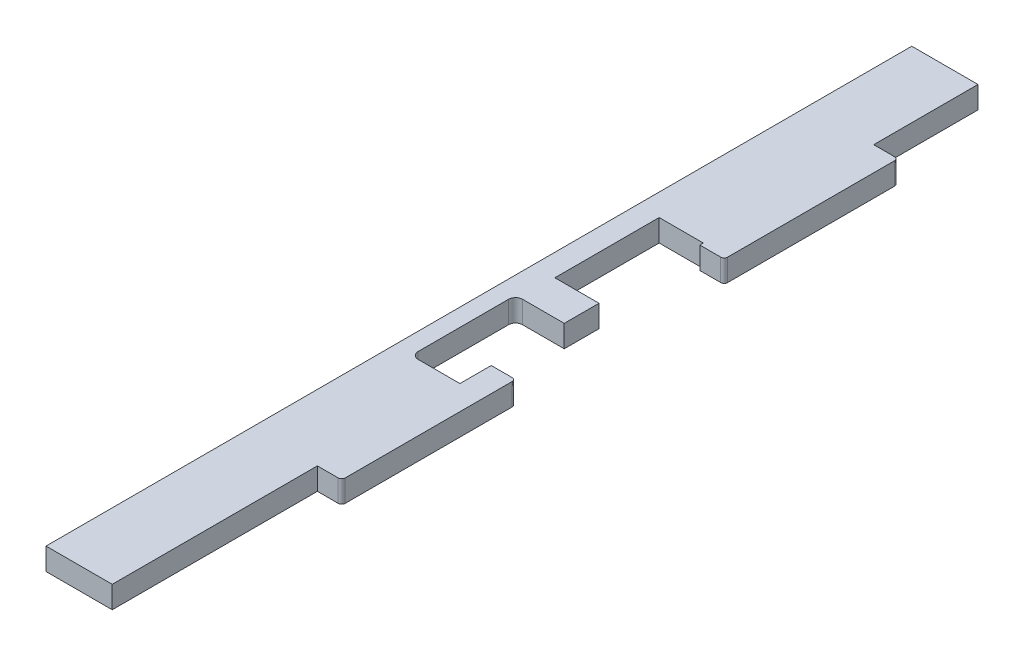
ISO-10303-21;
HEADER;
FILE_DESCRIPTION(('STEP AP214'),'2;1');
FILE_NAME('part.step','',(''),(''),'','','');
FILE_SCHEMA(('AUTOMOTIVE_DESIGN { 1 0 10303 214 1 1 1 1 }'));
ENDSEC;
DATA;
#1=APPLICATION_CONTEXT('core data for automotive mechanical design processes');
#2=APPLICATION_PROTOCOL_DEFINITION('international standard','automotive_design',2000,#1);
#3=PRODUCT_CONTEXT('',#1,'mechanical');
#4=PRODUCT('Part','Part','',(#3));
#5=PRODUCT_RELATED_PRODUCT_CATEGORY('part','',(#4));
#6=PRODUCT_DEFINITION_FORMATION('','',#4);
#7=PRODUCT_DEFINITION_CONTEXT('part definition',#1,'design');
#8=PRODUCT_DEFINITION('design','',#6,#7);
#9=PRODUCT_DEFINITION_SHAPE('','',#8);
#10=(LENGTH_UNIT() NAMED_UNIT(*) SI_UNIT(.MILLI.,.METRE.));
#11=(NAMED_UNIT(*) PLANE_ANGLE_UNIT() SI_UNIT($,.RADIAN.));
#12=(NAMED_UNIT(*) SI_UNIT($,.STERADIAN.) SOLID_ANGLE_UNIT());
#13=UNCERTAINTY_MEASURE_WITH_UNIT(LENGTH_MEASURE(1.E-05),#10,'distance_accuracy_value','');
#14=(GEOMETRIC_REPRESENTATION_CONTEXT(3) GLOBAL_UNCERTAINTY_ASSIGNED_CONTEXT((#13)) GLOBAL_UNIT_ASSIGNED_CONTEXT((#10,
#11,#12)) REPRESENTATION_CONTEXT('',''));
#15=CARTESIAN_POINT('',(0.,0.,0.));
#16=DIRECTION('',(0.,0.,1.));
#17=DIRECTION('',(1.,0.,0.));
#18=AXIS2_PLACEMENT_3D('',#15,#16,#17);
#19=CARTESIAN_POINT('',(-2.57955801104968,6.35,-210.312983425414));
#20=DIRECTION('',(1.,0.,0.));
#21=DIRECTION('',(0.,0.,-1.));
#22=AXIS2_PLACEMENT_3D('',#19,#20,#21);
#23=PLANE('',#22);
#24=DIRECTION('',(0.,0.,1.));
#25=VECTOR('',#24,1.);
#26=CARTESIAN_POINT('',(-2.57955801104968,0.,-210.312983425414));
#27=LINE('',#26,#25);
#28=CARTESIAN_POINT('',(-2.57955801104968,0.,-210.312983425414));
#29=VERTEX_POINT('',#28);
#30=CARTESIAN_POINT('',(-2.57955801104968,0.,38.6870165745856));
#31=VERTEX_POINT('',#30);
#32=EDGE_CURVE('E251',#29,#31,#27,.T.);
#33=ORIENTED_EDGE('',*,*,#32,.T.);
#34=DIRECTION('',(0.,-1.,0.));
#35=VECTOR('',#34,1.);
#36=CARTESIAN_POINT('',(-2.57955801104968,6.35,38.6870165745856));
#37=LINE('',#36,#35);
#38=CARTESIAN_POINT('',(-2.57955801104968,6.35,38.6870165745856));
#39=VERTEX_POINT('',#38);
#40=EDGE_CURVE('E11',#39,#31,#37,.T.);
#41=ORIENTED_EDGE('',*,*,#40,.F.);
#42=DIRECTION('',(0.,0.,1.));
#43=VECTOR('',#42,1.);
#44=CARTESIAN_POINT('',(-2.57955801104968,6.35,-210.312983425414));
#45=LINE('',#44,#43);
#46=CARTESIAN_POINT('',(-2.57955801104968,6.35,-210.312983425414));
#47=VERTEX_POINT('',#46);
#48=EDGE_CURVE('E285',#47,#39,#45,.T.);
#49=ORIENTED_EDGE('',*,*,#48,.F.);
#50=DIRECTION('',(0.,-1.,0.));
#51=VECTOR('',#50,1.);
#52=CARTESIAN_POINT('',(-2.57955801104968,6.35,-210.312983425414));
#53=LINE('',#52,#51);
#54=EDGE_CURVE('E250',#47,#29,#53,.T.);
#55=ORIENTED_EDGE('',*,*,#54,.T.);
#56=EDGE_LOOP('',(#33,#41,#49,#55));
#57=FACE_BOUND('',#56,.T.);
#58=ADVANCED_FACE('F32',(#57),#23,.F.);
#59=CARTESIAN_POINT('',(-2.57955801104968,6.35,38.6870165745856));
#60=DIRECTION('',(0.,0.,-1.));
#61=DIRECTION('',(-1.,0.,0.));
#62=AXIS2_PLACEMENT_3D('',#59,#60,#61);
#63=PLANE('',#62);
#64=DIRECTION('',(1.,0.,0.));
#65=VECTOR('',#64,1.);
#66=CARTESIAN_POINT('',(-2.57955801104968,0.,38.6870165745856));
#67=LINE('',#66,#65);
#68=CARTESIAN_POINT('',(16.4704419889503,0.,38.6870165745856));
#69=VERTEX_POINT('',#68);
#70=EDGE_CURVE('E254',#31,#69,#67,.T.);
#71=ORIENTED_EDGE('',*,*,#70,.T.);
#72=DIRECTION('',(0.,-1.,0.));
#73=VECTOR('',#72,1.);
#74=CARTESIAN_POINT('',(16.4704419889503,6.35,38.6870165745856));
#75=LINE('',#74,#73);
#76=CARTESIAN_POINT('',(16.4704419889503,6.35,38.6870165745856));
#77=VERTEX_POINT('',#76);
#78=EDGE_CURVE('E39',#77,#69,#75,.T.);
#79=ORIENTED_EDGE('',*,*,#78,.F.);
#80=DIRECTION('',(1.,0.,0.));
#81=VECTOR('',#80,1.);
#82=CARTESIAN_POINT('',(-2.57955801104968,6.35,38.6870165745856));
#83=LINE('',#82,#81);
#84=EDGE_CURVE('E420',#39,#77,#83,.T.);
#85=ORIENTED_EDGE('',*,*,#84,.F.);
#86=ORIENTED_EDGE('',*,*,#40,.T.);
#87=EDGE_LOOP('',(#71,#79,#85,#86));
#88=FACE_BOUND('',#87,.T.);
#89=ADVANCED_FACE('F423',(#88),#63,.F.);
#90=CARTESIAN_POINT('',(16.4704419889503,6.35,38.6870165745856));
#91=DIRECTION('',(-1.,0.,0.));
#92=DIRECTION('',(0.,0.,1.));
#93=AXIS2_PLACEMENT_3D('',#90,#91,#92);
#94=PLANE('',#93);
#95=DIRECTION('',(0.,0.,-1.));
#96=VECTOR('',#95,1.);
#97=CARTESIAN_POINT('',(16.4704419889503,0.,38.6870165745856));
#98=LINE('',#97,#96);
#99=CARTESIAN_POINT('',(16.4704419889503,0.,-20.3129834254144));
#100=VERTEX_POINT('',#99);
#101=EDGE_CURVE('E257',#69,#100,#98,.T.);
#102=ORIENTED_EDGE('',*,*,#101,.T.);
#103=DIRECTION('',(0.,-1.,0.));
#104=VECTOR('',#103,1.);
#105=CARTESIAN_POINT('',(16.4704419889503,6.35,-20.3129834254144));
#106=LINE('',#105,#104);
#107=CARTESIAN_POINT('',(16.4704419889503,6.35,-20.3129834254144));
#108=VERTEX_POINT('',#107);
#109=EDGE_CURVE('E323',#108,#100,#106,.T.);
#110=ORIENTED_EDGE('',*,*,#109,.F.);
#111=DIRECTION('',(0.,0.,-1.));
#112=VECTOR('',#111,1.);
#113=CARTESIAN_POINT('',(16.4704419889503,6.35,38.6870165745856));
#114=LINE('',#113,#112);
#115=EDGE_CURVE('E332',#77,#108,#114,.T.);
#116=ORIENTED_EDGE('',*,*,#115,.F.);
#117=ORIENTED_EDGE('',*,*,#78,.T.);
#118=EDGE_LOOP('',(#102,#110,#116,#117));
#119=FACE_BOUND('',#118,.T.);
#120=ADVANCED_FACE('F330',(#119),#94,.F.);
#121=CARTESIAN_POINT('',(16.4704419889503,6.35,-20.3129834254144));
#122=DIRECTION('',(0.,0.,-1.));
#123=DIRECTION('',(-1.,0.,0.));
#124=AXIS2_PLACEMENT_3D('',#121,#122,#123);
#125=PLANE('',#124);
#126=DIRECTION('',(1.,0.,0.));
#127=VECTOR('',#126,1.);
#128=CARTESIAN_POINT('',(16.4704419889503,0.,-20.3129834254144));
#129=LINE('',#128,#127);
#130=CARTESIAN_POINT('',(22.4704419889503,0.,-20.3129834254144));
#131=VERTEX_POINT('',#130);
#132=EDGE_CURVE('E259',#100,#131,#129,.T.);
#133=ORIENTED_EDGE('',*,*,#132,.T.);
#134=DIRECTION('',(0.,-1.,0.));
#135=VECTOR('',#134,1.);
#136=CARTESIAN_POINT('',(22.4704419889503,6.35,-20.3129834254144));
#137=LINE('',#136,#135);
#138=CARTESIAN_POINT('',(22.4704419889503,6.35,-20.3129834254144));
#139=VERTEX_POINT('',#138);
#140=EDGE_CURVE('E320',#139,#131,#137,.T.);
#141=ORIENTED_EDGE('',*,*,#140,.F.);
#142=DIRECTION('',(1.,0.,0.));
#143=VECTOR('',#142,1.);
#144=CARTESIAN_POINT('',(16.4704419889503,6.35,-20.3129834254144));
#145=LINE('',#144,#143);
#146=EDGE_CURVE('E352',#108,#139,#145,.T.);
#147=ORIENTED_EDGE('',*,*,#146,.F.);
#148=ORIENTED_EDGE('',*,*,#109,.T.);
#149=EDGE_LOOP('',(#133,#141,#147,#148));
#150=FACE_BOUND('',#149,.T.);
#151=ADVANCED_FACE('F343',(#150),#125,.F.);
#152=CARTESIAN_POINT('',(22.4704419889503,6.35,-21.3129834254144));
#153=DIRECTION('',(0.,-1.,0.));
#154=DIRECTION('',(0.,0.,-1.));
#155=AXIS2_PLACEMENT_3D('',#152,#153,#154);
#156=CYLINDRICAL_SURFACE('',#155,1.);
#157=CARTESIAN_POINT('',(22.4704419889503,0.,-21.3129834254144));
#158=DIRECTION('',(0.,1.,0.));
#159=DIRECTION('',(0.,0.,1.));
#160=AXIS2_PLACEMENT_3D('',#157,#158,#159);
#161=CIRCLE('',#160,1.);
#162=CARTESIAN_POINT('',(23.4704419889503,0.,-21.3129834254144));
#163=VERTEX_POINT('',#162);
#164=EDGE_CURVE('E261',#131,#163,#161,.T.);
#165=ORIENTED_EDGE('',*,*,#164,.T.);
#166=DIRECTION('',(0.,-1.,0.));
#167=VECTOR('',#166,1.);
#168=CARTESIAN_POINT('',(23.4704419889503,6.35,-21.3129834254144));
#169=LINE('',#168,#167);
#170=CARTESIAN_POINT('',(23.4704419889503,6.35,-21.3129834254144));
#171=VERTEX_POINT('',#170);
#172=EDGE_CURVE('E317',#171,#163,#169,.T.);
#173=ORIENTED_EDGE('',*,*,#172,.F.);
#174=CARTESIAN_POINT('',(22.4704419889503,6.35,-21.3129834254144));
#175=DIRECTION('',(0.,1.,0.));
#176=DIRECTION('',(0.,0.,1.));
#177=AXIS2_PLACEMENT_3D('',#174,#175,#176);
#178=CIRCLE('',#177,1.);
#179=EDGE_CURVE('E349',#139,#171,#178,.T.);
#180=ORIENTED_EDGE('',*,*,#179,.F.);
#181=ORIENTED_EDGE('',*,*,#140,.T.);
#182=EDGE_LOOP('',(#165,#173,#180,#181));
#183=FACE_BOUND('',#182,.T.);
#184=ADVANCED_FACE('F347',(#183),#156,.T.);
#185=CARTESIAN_POINT('',(23.4704419889503,6.35,-21.3129834254144));
#186=DIRECTION('',(-1.,0.,0.));
#187=DIRECTION('',(0.,0.,1.));
#188=AXIS2_PLACEMENT_3D('',#185,#186,#187);
#189=PLANE('',#188);
#190=DIRECTION('',(0.,0.,-1.));
#191=VECTOR('',#190,1.);
#192=CARTESIAN_POINT('',(23.4704419889503,0.,-21.3129834254144));
#193=LINE('',#192,#191);
#194=CARTESIAN_POINT('',(23.4704419889503,0.,-69.3129834254144));
#195=VERTEX_POINT('',#194);
#196=EDGE_CURVE('E263',#163,#195,#193,.T.);
#197=ORIENTED_EDGE('',*,*,#196,.T.);
#198=DIRECTION('',(0.,-1.,0.));
#199=VECTOR('',#198,1.);
#200=CARTESIAN_POINT('',(23.4704419889503,6.35,-69.3129834254144));
#201=LINE('',#200,#199);
#202=CARTESIAN_POINT('',(23.4704419889503,6.35,-69.3129834254144));
#203=VERTEX_POINT('',#202);
#204=EDGE_CURVE('E314',#203,#195,#201,.T.);
#205=ORIENTED_EDGE('',*,*,#204,.F.);
#206=DIRECTION('',(0.,0.,-1.));
#207=VECTOR('',#206,1.);
#208=CARTESIAN_POINT('',(23.4704419889503,6.35,-21.3129834254144));
#209=LINE('',#208,#207);
#210=EDGE_CURVE('E351',#171,#203,#209,.T.);
#211=ORIENTED_EDGE('',*,*,#210,.F.);
#212=ORIENTED_EDGE('',*,*,#172,.T.);
#213=EDGE_LOOP('',(#197,#205,#211,#212));
#214=FACE_BOUND('',#213,.T.);
#215=ADVANCED_FACE('F509',(#214),#189,.F.);
#216=CARTESIAN_POINT('',(22.4704419889503,6.35,-69.3129834254144));
#217=DIRECTION('',(0.,-1.,0.));
#218=DIRECTION('',(0.,0.,-1.));
#219=AXIS2_PLACEMENT_3D('',#216,#217,#218);
#220=CYLINDRICAL_SURFACE('',#219,1.);
#221=CARTESIAN_POINT('',(22.4704419889503,0.,-69.3129834254144));
#222=DIRECTION('',(0.,1.,0.));
#223=DIRECTION('',(0.,0.,1.));
#224=AXIS2_PLACEMENT_3D('',#221,#222,#223);
#225=CIRCLE('',#224,1.);
#226=CARTESIAN_POINT('',(22.4704419889503,0.,-70.3129834254144));
#227=VERTEX_POINT('',#226);
#228=EDGE_CURVE('E265',#195,#227,#225,.T.);
#229=ORIENTED_EDGE('',*,*,#228,.T.);
#230=DIRECTION('',(0.,-1.,0.));
#231=VECTOR('',#230,1.);
#232=CARTESIAN_POINT('',(22.4704419889503,6.35,-70.3129834254144));
#233=LINE('',#232,#231);
#234=CARTESIAN_POINT('',(22.4704419889503,6.35,-70.3129834254144));
#235=VERTEX_POINT('',#234);
#236=EDGE_CURVE('E311',#235,#227,#233,.T.);
#237=ORIENTED_EDGE('',*,*,#236,.F.);
#238=CARTESIAN_POINT('',(22.4704419889503,6.35,-69.3129834254144));
#239=DIRECTION('',(0.,1.,0.));
#240=DIRECTION('',(0.,0.,1.));
#241=AXIS2_PLACEMENT_3D('',#238,#239,#240);
#242=CIRCLE('',#241,1.);
#243=EDGE_CURVE('E235',#203,#235,#242,.T.);
#244=ORIENTED_EDGE('',*,*,#243,.F.);
#245=ORIENTED_EDGE('',*,*,#204,.T.);
#246=EDGE_LOOP('',(#229,#237,#244,#245));
#247=FACE_BOUND('',#246,.T.);
#248=ADVANCED_FACE('F364',(#247),#220,.T.);
#249=CARTESIAN_POINT('',(22.4704419889503,6.35,-70.3129834254144));
#250=DIRECTION('',(0.,0.,1.));
#251=DIRECTION('',(1.,0.,0.));
#252=AXIS2_PLACEMENT_3D('',#249,#250,#251);
#253=PLANE('',#252);
#254=DIRECTION('',(-1.,0.,0.));
#255=VECTOR('',#254,1.);
#256=CARTESIAN_POINT('',(22.4704419889503,0.,-70.3129834254144));
#257=LINE('',#256,#255);
#258=CARTESIAN_POINT('',(16.4704419889503,0.,-70.3129834254144));
#259=VERTEX_POINT('',#258);
#260=EDGE_CURVE('E267',#227,#259,#257,.T.);
#261=ORIENTED_EDGE('',*,*,#260,.T.);
#262=DIRECTION('',(0.,-1.,0.));
#263=VECTOR('',#262,1.);
#264=CARTESIAN_POINT('',(16.4704419889503,6.35,-70.3129834254144));
#265=LINE('',#264,#263);
#266=CARTESIAN_POINT('',(16.4704419889503,6.35,-70.3129834254144));
#267=VERTEX_POINT('',#266);
#268=EDGE_CURVE('E309',#267,#259,#265,.T.);
#269=ORIENTED_EDGE('',*,*,#268,.F.);
#270=DIRECTION('',(-1.,0.,0.));
#271=VECTOR('',#270,1.);
#272=CARTESIAN_POINT('',(22.4704419889503,6.35,-70.3129834254144));
#273=LINE('',#272,#271);
#274=EDGE_CURVE('E230',#235,#267,#273,.T.);
#275=ORIENTED_EDGE('',*,*,#274,.F.);
#276=ORIENTED_EDGE('',*,*,#236,.T.);
#277=EDGE_LOOP('',(#261,#269,#275,#276));
#278=FACE_BOUND('',#277,.T.);
#279=ADVANCED_FACE('F368',(#278),#253,.F.);
#280=CARTESIAN_POINT('',(16.4704419889503,6.35,-70.3129834254144));
#281=DIRECTION('',(-1.,0.,0.));
#282=DIRECTION('',(0.,0.,1.));
#283=AXIS2_PLACEMENT_3D('',#280,#281,#282);
#284=PLANE('',#283);
#285=DIRECTION('',(0.,0.,-1.));
#286=VECTOR('',#285,1.);
#287=CARTESIAN_POINT('',(16.4704419889503,0.,-70.3129834254144));
#288=LINE('',#287,#286);
#289=CARTESIAN_POINT('',(16.4704419889503,0.,-91.3129834254144));
#290=VERTEX_POINT('',#289);
#291=CARTESIAN_POINT('',(16.4704419889503,0.,-101.312983425414));
#292=VERTEX_POINT('',#291);
#293=EDGE_CURVE('E220',#290,#292,#288,.T.);
#294=ORIENTED_EDGE('',*,*,#293,.T.);
#295=DIRECTION('',(0.,-1.,0.));
#296=VECTOR('',#295,1.);
#297=CARTESIAN_POINT('',(16.4704419889503,6.35,-101.312983425414));
#298=LINE('',#297,#296);
#299=CARTESIAN_POINT('',(16.4704419889503,6.35,-101.312983425414));
#300=VERTEX_POINT('',#299);
#301=EDGE_CURVE('E46',#300,#292,#298,.T.);
#302=ORIENTED_EDGE('',*,*,#301,.F.);
#303=DIRECTION('',(0.,0.,-1.));
#304=VECTOR('',#303,1.);
#305=CARTESIAN_POINT('',(16.4704419889503,6.35,-70.3129834254144));
#306=LINE('',#305,#304);
#307=CARTESIAN_POINT('',(16.4704419889503,6.35,-91.3129834254144));
#308=VERTEX_POINT('',#307);
#309=EDGE_CURVE('E218',#308,#300,#306,.T.);
#310=ORIENTED_EDGE('',*,*,#309,.F.);
#311=DIRECTION('',(0.,1.,0.));
#312=VECTOR('',#311,1.);
#313=CARTESIAN_POINT('',(16.4704419889503,0.,-91.3129834254144));
#314=LINE('',#313,#312);
#315=EDGE_CURVE('E396',#290,#308,#314,.T.);
#316=ORIENTED_EDGE('',*,*,#315,.F.);
#317=EDGE_LOOP('',(#294,#302,#310,#316));
#318=FACE_BOUND('',#317,.T.);
#319=ADVANCED_FACE('F216',(#318),#284,.F.);
#320=CARTESIAN_POINT('',(16.4704419889503,6.35,-130.312983425414));
#321=DIRECTION('',(0.,0.,-1.));
#322=DIRECTION('',(-1.,0.,0.));
#323=AXIS2_PLACEMENT_3D('',#320,#321,#322);
#324=PLANE('',#323);
#325=DIRECTION('',(1.,0.,0.));
#326=VECTOR('',#325,1.);
#327=CARTESIAN_POINT('',(16.4704419889503,0.,-130.312983425414));
#328=LINE('',#327,#326);
#329=CARTESIAN_POINT('',(16.4704419889503,0.,-130.312983425414));
#330=VERTEX_POINT('',#329);
#331=CARTESIAN_POINT('',(22.4704419889503,0.,-130.312983425414));
#332=VERTEX_POINT('',#331);
#333=EDGE_CURVE('E271',#330,#332,#328,.T.);
#334=ORIENTED_EDGE('',*,*,#333,.T.);
#335=DIRECTION('',(0.,-1.,0.));
#336=VECTOR('',#335,1.);
#337=CARTESIAN_POINT('',(22.4704419889503,6.35,-130.312983425414));
#338=LINE('',#337,#336);
#339=CARTESIAN_POINT('',(22.4704419889503,6.35,-130.312983425414));
#340=VERTEX_POINT('',#339);
#341=EDGE_CURVE('E303',#340,#332,#338,.T.);
#342=ORIENTED_EDGE('',*,*,#341,.F.);
#343=DIRECTION('',(1.,0.,0.));
#344=VECTOR('',#343,1.);
#345=CARTESIAN_POINT('',(16.4704419889503,6.35,-130.312983425414));
#346=LINE('',#345,#344);
#347=CARTESIAN_POINT('',(16.4704419889503,6.35,-130.312983425414));
#348=VERTEX_POINT('',#347);
#349=EDGE_CURVE('E229',#348,#340,#346,.T.);
#350=ORIENTED_EDGE('',*,*,#349,.F.);
#351=DIRECTION('',(0.,-1.,0.));
#352=VECTOR('',#351,1.);
#353=CARTESIAN_POINT('',(16.4704419889503,6.35,-130.312983425414));
#354=LINE('',#353,#352);
#355=EDGE_CURVE('E306',#348,#330,#354,.T.);
#356=ORIENTED_EDGE('',*,*,#355,.T.);
#357=EDGE_LOOP('',(#334,#342,#350,#356));
#358=FACE_BOUND('',#357,.T.);
#359=ADVANCED_FACE('F460',(#358),#324,.F.);
#360=CARTESIAN_POINT('',(22.4704419889503,6.35,-131.312983425414));
#361=DIRECTION('',(0.,-1.,0.));
#362=DIRECTION('',(0.,0.,-1.));
#363=AXIS2_PLACEMENT_3D('',#360,#361,#362);
#364=CYLINDRICAL_SURFACE('',#363,1.);
#365=CARTESIAN_POINT('',(22.4704419889503,0.,-131.312983425414));
#366=DIRECTION('',(0.,1.,0.));
#367=DIRECTION('',(0.,0.,1.));
#368=AXIS2_PLACEMENT_3D('',#365,#366,#367);
#369=CIRCLE('',#368,1.);
#370=CARTESIAN_POINT('',(23.4704419889503,0.,-131.312983425414));
#371=VERTEX_POINT('',#370);
#372=EDGE_CURVE('E273',#332,#371,#369,.T.);
#373=ORIENTED_EDGE('',*,*,#372,.T.);
#374=DIRECTION('',(0.,-1.,0.));
#375=VECTOR('',#374,1.);
#376=CARTESIAN_POINT('',(23.4704419889503,6.35,-131.312983425414));
#377=LINE('',#376,#375);
#378=CARTESIAN_POINT('',(23.4704419889503,6.35,-131.312983425414));
#379=VERTEX_POINT('',#378);
#380=EDGE_CURVE('E300',#379,#371,#377,.T.);
#381=ORIENTED_EDGE('',*,*,#380,.F.);
#382=CARTESIAN_POINT('',(22.4704419889503,6.35,-131.312983425414));
#383=DIRECTION('',(0.,1.,0.));
#384=DIRECTION('',(0.,0.,1.));
#385=AXIS2_PLACEMENT_3D('',#382,#383,#384);
#386=CIRCLE('',#385,1.);
#387=EDGE_CURVE('E232',#340,#379,#386,.T.);
#388=ORIENTED_EDGE('',*,*,#387,.F.);
#389=ORIENTED_EDGE('',*,*,#341,.T.);
#390=EDGE_LOOP('',(#373,#381,#388,#389));
#391=FACE_BOUND('',#390,.T.);
#392=ADVANCED_FACE('F454',(#391),#364,.T.);
#393=CARTESIAN_POINT('',(23.4704419889503,6.35,-131.312983425414));
#394=DIRECTION('',(-1.,0.,0.));
#395=DIRECTION('',(0.,0.,1.));
#396=AXIS2_PLACEMENT_3D('',#393,#394,#395);
#397=PLANE('',#396);
#398=DIRECTION('',(0.,0.,-1.));
#399=VECTOR('',#398,1.);
#400=CARTESIAN_POINT('',(23.4704419889503,0.,-131.312983425414));
#401=LINE('',#400,#399);
#402=CARTESIAN_POINT('',(23.4704419889503,0.,-179.312983425414));
#403=VERTEX_POINT('',#402);
#404=EDGE_CURVE('E275',#371,#403,#401,.T.);
#405=ORIENTED_EDGE('',*,*,#404,.T.);
#406=DIRECTION('',(0.,-1.,0.));
#407=VECTOR('',#406,1.);
#408=CARTESIAN_POINT('',(23.4704419889503,6.35,-179.312983425414));
#409=LINE('',#408,#407);
#410=CARTESIAN_POINT('',(23.4704419889503,6.35,-179.312983425414));
#411=VERTEX_POINT('',#410);
#412=EDGE_CURVE('E297',#411,#403,#409,.T.);
#413=ORIENTED_EDGE('',*,*,#412,.F.);
#414=DIRECTION('',(0.,0.,-1.));
#415=VECTOR('',#414,1.);
#416=CARTESIAN_POINT('',(23.4704419889503,6.35,-131.312983425414));
#417=LINE('',#416,#415);
#418=EDGE_CURVE('E240',#379,#411,#417,.T.);
#419=ORIENTED_EDGE('',*,*,#418,.F.);
#420=ORIENTED_EDGE('',*,*,#380,.T.);
#421=EDGE_LOOP('',(#405,#413,#419,#420));
#422=FACE_BOUND('',#421,.T.);
#423=ADVANCED_FACE('F450',(#422),#397,.F.);
#424=CARTESIAN_POINT('',(22.4704419889503,6.35,-179.312983425414));
#425=DIRECTION('',(0.,-1.,0.));
#426=DIRECTION('',(0.,0.,-1.));
#427=AXIS2_PLACEMENT_3D('',#424,#425,#426);
#428=CYLINDRICAL_SURFACE('',#427,1.);
#429=CARTESIAN_POINT('',(22.4704419889503,0.,-179.312983425414));
#430=DIRECTION('',(0.,1.,0.));
#431=DIRECTION('',(0.,0.,1.));
#432=AXIS2_PLACEMENT_3D('',#429,#430,#431);
#433=CIRCLE('',#432,1.);
#434=CARTESIAN_POINT('',(22.4704419889503,0.,-180.312983425414));
#435=VERTEX_POINT('',#434);
#436=EDGE_CURVE('E277',#403,#435,#433,.T.);
#437=ORIENTED_EDGE('',*,*,#436,.T.);
#438=DIRECTION('',(0.,-1.,0.));
#439=VECTOR('',#438,1.);
#440=CARTESIAN_POINT('',(22.4704419889503,6.35,-180.312983425414));
#441=LINE('',#440,#439);
#442=CARTESIAN_POINT('',(22.4704419889503,6.35,-180.312983425414));
#443=VERTEX_POINT('',#442);
#444=EDGE_CURVE('E294',#443,#435,#441,.T.);
#445=ORIENTED_EDGE('',*,*,#444,.F.);
#446=CARTESIAN_POINT('',(22.4704419889503,6.35,-179.312983425414));
#447=DIRECTION('',(0.,1.,0.));
#448=DIRECTION('',(0.,0.,1.));
#449=AXIS2_PLACEMENT_3D('',#446,#447,#448);
#450=CIRCLE('',#449,1.);
#451=EDGE_CURVE('E242',#411,#443,#450,.T.);
#452=ORIENTED_EDGE('',*,*,#451,.F.);
#453=ORIENTED_EDGE('',*,*,#412,.T.);
#454=EDGE_LOOP('',(#437,#445,#452,#453));
#455=FACE_BOUND('',#454,.T.);
#456=ADVANCED_FACE('F445',(#455),#428,.T.);
#457=CARTESIAN_POINT('',(22.4704419889503,6.35,-180.312983425414));
#458=DIRECTION('',(0.,0.,1.));
#459=DIRECTION('',(1.,0.,0.));
#460=AXIS2_PLACEMENT_3D('',#457,#458,#459);
#461=PLANE('',#460);
#462=DIRECTION('',(-1.,0.,0.));
#463=VECTOR('',#462,1.);
#464=CARTESIAN_POINT('',(22.4704419889503,0.,-180.312983425414));
#465=LINE('',#464,#463);
#466=CARTESIAN_POINT('',(16.4704419889503,0.,-180.312983425414));
#467=VERTEX_POINT('',#466);
#468=EDGE_CURVE('E279',#435,#467,#465,.T.);
#469=ORIENTED_EDGE('',*,*,#468,.T.);
#470=DIRECTION('',(0.,-1.,0.));
#471=VECTOR('',#470,1.);
#472=CARTESIAN_POINT('',(16.4704419889503,6.35,-180.312983425414));
#473=LINE('',#472,#471);
#474=CARTESIAN_POINT('',(16.4704419889503,6.35,-180.312983425414));
#475=VERTEX_POINT('',#474);
#476=EDGE_CURVE('E291',#475,#467,#473,.T.);
#477=ORIENTED_EDGE('',*,*,#476,.F.);
#478=DIRECTION('',(-1.,0.,0.));
#479=VECTOR('',#478,1.);
#480=CARTESIAN_POINT('',(22.4704419889503,6.35,-180.312983425414));
#481=LINE('',#480,#479);
#482=EDGE_CURVE('E244',#443,#475,#481,.T.);
#483=ORIENTED_EDGE('',*,*,#482,.F.);
#484=ORIENTED_EDGE('',*,*,#444,.T.);
#485=EDGE_LOOP('',(#469,#477,#483,#484));
#486=FACE_BOUND('',#485,.T.);
#487=ADVANCED_FACE('F439',(#486),#461,.F.);
#488=CARTESIAN_POINT('',(16.4704419889503,6.35,-180.312983425414));
#489=DIRECTION('',(-1.,0.,0.));
#490=DIRECTION('',(0.,0.,1.));
#491=AXIS2_PLACEMENT_3D('',#488,#489,#490);
#492=PLANE('',#491);
#493=DIRECTION('',(0.,0.,-1.));
#494=VECTOR('',#493,1.);
#495=CARTESIAN_POINT('',(16.4704419889503,0.,-180.312983425414));
#496=LINE('',#495,#494);
#497=CARTESIAN_POINT('',(16.4704419889503,0.,-210.312983425414));
#498=VERTEX_POINT('',#497);
#499=EDGE_CURVE('E281',#467,#498,#496,.T.);
#500=ORIENTED_EDGE('',*,*,#499,.T.);
#501=DIRECTION('',(0.,-1.,0.));
#502=VECTOR('',#501,1.);
#503=CARTESIAN_POINT('',(16.4704419889503,6.35,-210.312983425414));
#504=LINE('',#503,#502);
#505=CARTESIAN_POINT('',(16.4704419889503,6.35,-210.312983425414));
#506=VERTEX_POINT('',#505);
#507=EDGE_CURVE('E288',#506,#498,#504,.T.);
#508=ORIENTED_EDGE('',*,*,#507,.F.);
#509=DIRECTION('',(0.,0.,-1.));
#510=VECTOR('',#509,1.);
#511=CARTESIAN_POINT('',(16.4704419889503,6.35,-180.312983425414));
#512=LINE('',#511,#510);
#513=EDGE_CURVE('E246',#475,#506,#512,.T.);
#514=ORIENTED_EDGE('',*,*,#513,.F.);
#515=ORIENTED_EDGE('',*,*,#476,.T.);
#516=EDGE_LOOP('',(#500,#508,#514,#515));
#517=FACE_BOUND('',#516,.T.);
#518=ADVANCED_FACE('F435',(#517),#492,.F.);
#519=CARTESIAN_POINT('',(16.4704419889503,6.35,-210.312983425414));
#520=DIRECTION('',(0.,0.,1.));
#521=DIRECTION('',(1.,0.,0.));
#522=AXIS2_PLACEMENT_3D('',#519,#520,#521);
#523=PLANE('',#522);
#524=DIRECTION('',(-1.,0.,0.));
#525=VECTOR('',#524,1.);
#526=CARTESIAN_POINT('',(16.4704419889503,0.,-210.312983425414));
#527=LINE('',#526,#525);
#528=EDGE_CURVE('E283',#498,#29,#527,.T.);
#529=ORIENTED_EDGE('',*,*,#528,.T.);
#530=ORIENTED_EDGE('',*,*,#54,.F.);
#531=DIRECTION('',(-1.,0.,0.));
#532=VECTOR('',#531,1.);
#533=CARTESIAN_POINT('',(16.4704419889503,6.35,-210.312983425414));
#534=LINE('',#533,#532);
#535=EDGE_CURVE('E248',#506,#47,#534,.T.);
#536=ORIENTED_EDGE('',*,*,#535,.F.);
#537=ORIENTED_EDGE('',*,*,#507,.T.);
#538=EDGE_LOOP('',(#529,#530,#536,#537));
#539=FACE_BOUND('',#538,.T.);
#540=ADVANCED_FACE('F430',(#539),#523,.F.);
#541=CARTESIAN_POINT('',(22.4704419889503,6.35,-21.3129834254144));
#542=DIRECTION('',(0.,1.,0.));
#543=DIRECTION('',(0.,0.,1.));
#544=AXIS2_PLACEMENT_3D('',#541,#542,#543);
#545=PLANE('',#544);
#546=DIRECTION('',(0.,0.,1.));
#547=VECTOR('',#546,1.);
#548=CARTESIAN_POINT('',(16.4704419889503,6.35,-101.312983425414));
#549=LINE('',#548,#547);
#550=CARTESIAN_POINT('',(16.4704419889503,6.35,-131.312983425414));
#551=VERTEX_POINT('',#550);
#552=EDGE_CURVE('E211',#551,#348,#549,.T.);
#553=ORIENTED_EDGE('',*,*,#552,.T.);
#554=ORIENTED_EDGE('',*,*,#349,.T.);
#555=ORIENTED_EDGE('',*,*,#387,.T.);
#556=ORIENTED_EDGE('',*,*,#418,.T.);
#557=ORIENTED_EDGE('',*,*,#451,.T.);
#558=ORIENTED_EDGE('',*,*,#482,.T.);
#559=ORIENTED_EDGE('',*,*,#513,.T.);
#560=ORIENTED_EDGE('',*,*,#535,.T.);
#561=ORIENTED_EDGE('',*,*,#48,.T.);
#562=ORIENTED_EDGE('',*,*,#84,.T.);
#563=ORIENTED_EDGE('',*,*,#115,.T.);
#564=ORIENTED_EDGE('',*,*,#146,.T.);
#565=ORIENTED_EDGE('',*,*,#179,.T.);
#566=ORIENTED_EDGE('',*,*,#210,.T.);
#567=ORIENTED_EDGE('',*,*,#243,.T.);
#568=ORIENTED_EDGE('',*,*,#274,.T.);
#569=DIRECTION('',(0.,0.,-1.));
#570=VECTOR('',#569,1.);
#571=CARTESIAN_POINT('',(16.4704419889503,6.35,-61.3129834254144));
#572=LINE('',#571,#570);
#573=CARTESIAN_POINT('',(16.4704419889503,6.35,-61.3129834254144));
#574=VERTEX_POINT('',#573);
#575=EDGE_CURVE('E375',#574,#267,#572,.T.);
#576=ORIENTED_EDGE('',*,*,#575,.F.);
#577=DIRECTION('',(1.,0.,0.));
#578=VECTOR('',#577,1.);
#579=CARTESIAN_POINT('',(16.4704419889503,6.35,-61.3129834254144));
#580=LINE('',#579,#578);
#581=CARTESIAN_POINT('',(4.47044198895034,6.35,-61.3129834254144));
#582=VERTEX_POINT('',#581);
#583=EDGE_CURVE('E380',#582,#574,#580,.T.);
#584=ORIENTED_EDGE('',*,*,#583,.F.);
#585=CARTESIAN_POINT('',(4.47044198895032,6.35,-63.3129834254144));
#586=DIRECTION('',(0.,1.,0.));
#587=DIRECTION('',(0.,0.,-1.));
#588=AXIS2_PLACEMENT_3D('',#585,#586,#587);
#589=CIRCLE('',#588,2.);
#590=CARTESIAN_POINT('',(2.47044198895032,6.35,-63.3129834254144));
#591=VERTEX_POINT('',#590);
#592=EDGE_CURVE('E385',#591,#582,#589,.T.);
#593=ORIENTED_EDGE('',*,*,#592,.F.);
#594=DIRECTION('',(0.,0.,1.));
#595=VECTOR('',#594,1.);
#596=CARTESIAN_POINT('',(2.47044198895032,6.35,-63.3129834254144));
#597=LINE('',#596,#595);
#598=CARTESIAN_POINT('',(2.47044198895032,6.35,-89.3129834254144));
#599=VERTEX_POINT('',#598);
#600=EDGE_CURVE('E403',#599,#591,#597,.T.);
#601=ORIENTED_EDGE('',*,*,#600,.F.);
#602=CARTESIAN_POINT('',(4.47044198895032,6.35,-89.3129834254144));
#603=DIRECTION('',(0.,1.,0.));
#604=DIRECTION('',(0.,0.,-1.));
#605=AXIS2_PLACEMENT_3D('',#602,#603,#604);
#606=CIRCLE('',#605,2.);
#607=CARTESIAN_POINT('',(4.47044198895032,6.35,-91.3129834254144));
#608=VERTEX_POINT('',#607);
#609=EDGE_CURVE('E400',#608,#599,#606,.T.);
#610=ORIENTED_EDGE('',*,*,#609,.F.);
#611=DIRECTION('',(-1.,0.,0.));
#612=VECTOR('',#611,1.);
#613=CARTESIAN_POINT('',(16.4704419889503,6.35,-91.3129834254144));
#614=LINE('',#613,#612);
#615=EDGE_CURVE('E228',#308,#608,#614,.T.);
#616=ORIENTED_EDGE('',*,*,#615,.F.);
#617=ORIENTED_EDGE('',*,*,#309,.T.);
#618=DIRECTION('',(-1.,0.,0.));
#619=VECTOR('',#618,1.);
#620=CARTESIAN_POINT('',(16.4704419889503,6.35,-101.312983425414));
#621=LINE('',#620,#619);
#622=CARTESIAN_POINT('',(3.77044198895031,6.35,-101.312983425414));
#623=VERTEX_POINT('',#622);
#624=EDGE_CURVE('E203',#300,#623,#621,.T.);
#625=ORIENTED_EDGE('',*,*,#624,.T.);
#626=DIRECTION('',(0.,0.,-1.));
#627=VECTOR('',#626,1.);
#628=CARTESIAN_POINT('',(3.77044198895031,6.35,-101.312983425414));
#629=LINE('',#628,#627);
#630=CARTESIAN_POINT('',(3.77044198895032,6.35,-131.312983425414));
#631=VERTEX_POINT('',#630);
#632=EDGE_CURVE('E210',#623,#631,#629,.T.);
#633=ORIENTED_EDGE('',*,*,#632,.T.);
#634=DIRECTION('',(1.,0.,0.));
#635=VECTOR('',#634,1.);
#636=CARTESIAN_POINT('',(16.4704419889503,6.35,-131.312983425414));
#637=LINE('',#636,#635);
#638=EDGE_CURVE('E221',#631,#551,#637,.T.);
#639=ORIENTED_EDGE('',*,*,#638,.T.);
#640=EDGE_LOOP('',(#553,#554,#555,#556,#557,#558,#559,#560,#561,#562,#563,#564,#565,#566,#567,
#568,#576,#584,#593,#601,#610,#616,#617,#625,#633,#639));
#641=FACE_BOUND('',#640,.T.);
#642=ADVANCED_FACE('F225',(#641),#545,.T.);
#643=CARTESIAN_POINT('',(22.4704419889503,0.,-21.3129834254144));
#644=DIRECTION('',(0.,1.,0.));
#645=DIRECTION('',(0.,0.,1.));
#646=AXIS2_PLACEMENT_3D('',#643,#644,#645);
#647=PLANE('',#646);
#648=ORIENTED_EDGE('',*,*,#333,.F.);
#649=DIRECTION('',(0.,0.,1.));
#650=VECTOR('',#649,1.);
#651=CARTESIAN_POINT('',(16.4704419889503,0.,-101.312983425414));
#652=LINE('',#651,#650);
#653=CARTESIAN_POINT('',(16.4704419889503,0.,-131.312983425414));
#654=VERTEX_POINT('',#653);
#655=EDGE_CURVE('E458',#654,#330,#652,.T.);
#656=ORIENTED_EDGE('',*,*,#655,.F.);
#657=DIRECTION('',(1.,0.,0.));
#658=VECTOR('',#657,1.);
#659=CARTESIAN_POINT('',(16.4704419889503,0.,-131.312983425414));
#660=LINE('',#659,#658);
#661=CARTESIAN_POINT('',(3.77044198895032,0.,-131.312983425414));
#662=VERTEX_POINT('',#661);
#663=EDGE_CURVE('E467',#662,#654,#660,.T.);
#664=ORIENTED_EDGE('',*,*,#663,.F.);
#665=DIRECTION('',(0.,0.,-1.));
#666=VECTOR('',#665,1.);
#667=CARTESIAN_POINT('',(3.77044198895031,0.,-101.312983425414));
#668=LINE('',#667,#666);
#669=CARTESIAN_POINT('',(3.77044198895031,0.,-101.312983425414));
#670=VERTEX_POINT('',#669);
#671=EDGE_CURVE('E470',#670,#662,#668,.T.);
#672=ORIENTED_EDGE('',*,*,#671,.F.);
#673=DIRECTION('',(-1.,0.,0.));
#674=VECTOR('',#673,1.);
#675=CARTESIAN_POINT('',(16.4704419889503,0.,-101.312983425414));
#676=LINE('',#675,#674);
#677=EDGE_CURVE('E476',#292,#670,#676,.T.);
#678=ORIENTED_EDGE('',*,*,#677,.F.);
#679=ORIENTED_EDGE('',*,*,#293,.F.);
#680=DIRECTION('',(-1.,0.,0.));
#681=VECTOR('',#680,1.);
#682=CARTESIAN_POINT('',(16.4704419889503,0.,-91.3129834254144));
#683=LINE('',#682,#681);
#684=CARTESIAN_POINT('',(4.47044198895032,0.,-91.3129834254144));
#685=VERTEX_POINT('',#684);
#686=EDGE_CURVE('E379',#290,#685,#683,.T.);
#687=ORIENTED_EDGE('',*,*,#686,.T.);
#688=CARTESIAN_POINT('',(4.47044198895032,0.,-89.3129834254144));
#689=DIRECTION('',(0.,1.,0.));
#690=DIRECTION('',(0.,0.,-1.));
#691=AXIS2_PLACEMENT_3D('',#688,#689,#690);
#692=CIRCLE('',#691,2.);
#693=CARTESIAN_POINT('',(2.47044198895032,0.,-89.3129834254144));
#694=VERTEX_POINT('',#693);
#695=EDGE_CURVE('E54',#685,#694,#692,.T.);
#696=ORIENTED_EDGE('',*,*,#695,.T.);
#697=DIRECTION('',(0.,0.,1.));
#698=VECTOR('',#697,1.);
#699=CARTESIAN_POINT('',(2.47044198895032,0.,-63.3129834254144));
#700=LINE('',#699,#698);
#701=CARTESIAN_POINT('',(2.47044198895032,0.,-63.3129834254144));
#702=VERTEX_POINT('',#701);
#703=EDGE_CURVE('E390',#694,#702,#700,.T.);
#704=ORIENTED_EDGE('',*,*,#703,.T.);
#705=CARTESIAN_POINT('',(4.47044198895032,0.,-63.3129834254144));
#706=DIRECTION('',(0.,1.,0.));
#707=DIRECTION('',(0.,0.,-1.));
#708=AXIS2_PLACEMENT_3D('',#705,#706,#707);
#709=CIRCLE('',#708,2.);
#710=CARTESIAN_POINT('',(4.47044198895034,0.,-61.3129834254144));
#711=VERTEX_POINT('',#710);
#712=EDGE_CURVE('E393',#702,#711,#709,.T.);
#713=ORIENTED_EDGE('',*,*,#712,.T.);
#714=DIRECTION('',(1.,0.,0.));
#715=VECTOR('',#714,1.);
#716=CARTESIAN_POINT('',(16.4704419889503,0.,-61.3129834254144));
#717=LINE('',#716,#715);
#718=CARTESIAN_POINT('',(16.4704419889503,0.,-61.3129834254144));
#719=VERTEX_POINT('',#718);
#720=EDGE_CURVE('E378',#711,#719,#717,.T.);
#721=ORIENTED_EDGE('',*,*,#720,.T.);
#722=DIRECTION('',(0.,0.,-1.));
#723=VECTOR('',#722,1.);
#724=CARTESIAN_POINT('',(16.4704419889503,0.,-61.3129834254144));
#725=LINE('',#724,#723);
#726=EDGE_CURVE('E373',#719,#259,#725,.T.);
#727=ORIENTED_EDGE('',*,*,#726,.T.);
#728=ORIENTED_EDGE('',*,*,#260,.F.);
#729=ORIENTED_EDGE('',*,*,#228,.F.);
#730=ORIENTED_EDGE('',*,*,#196,.F.);
#731=ORIENTED_EDGE('',*,*,#164,.F.);
#732=ORIENTED_EDGE('',*,*,#132,.F.);
#733=ORIENTED_EDGE('',*,*,#101,.F.);
#734=ORIENTED_EDGE('',*,*,#70,.F.);
#735=ORIENTED_EDGE('',*,*,#32,.F.);
#736=ORIENTED_EDGE('',*,*,#528,.F.);
#737=ORIENTED_EDGE('',*,*,#499,.F.);
#738=ORIENTED_EDGE('',*,*,#468,.F.);
#739=ORIENTED_EDGE('',*,*,#436,.F.);
#740=ORIENTED_EDGE('',*,*,#404,.F.);
#741=ORIENTED_EDGE('',*,*,#372,.F.);
#742=EDGE_LOOP('',(#648,#656,#664,#672,#678,#679,#687,#696,#704,#713,#721,#727,#728,#729,#730,
#731,#732,#733,#734,#735,#736,#737,#738,#739,#740,#741));
#743=FACE_BOUND('',#742,.T.);
#744=ADVANCED_FACE('F337',(#743),#647,.F.);
#745=CARTESIAN_POINT('',(16.4704419889503,0.,-61.3129834254144));
#746=DIRECTION('',(1.,0.,0.));
#747=DIRECTION('',(0.,0.,-1.));
#748=AXIS2_PLACEMENT_3D('',#745,#746,#747);
#749=PLANE('',#748);
#750=ORIENTED_EDGE('',*,*,#726,.F.);
#751=DIRECTION('',(0.,1.,0.));
#752=VECTOR('',#751,1.);
#753=CARTESIAN_POINT('',(16.4704419889503,0.,-61.3129834254144));
#754=LINE('',#753,#752);
#755=EDGE_CURVE('E255',#719,#574,#754,.T.);
#756=ORIENTED_EDGE('',*,*,#755,.T.);
#757=ORIENTED_EDGE('',*,*,#575,.T.);
#758=ORIENTED_EDGE('',*,*,#268,.T.);
#759=EDGE_LOOP('',(#750,#756,#757,#758));
#760=FACE_BOUND('',#759,.T.);
#761=ADVANCED_FACE('F372',(#760),#749,.F.);
#762=CARTESIAN_POINT('',(16.4704419889503,0.,-61.3129834254144));
#763=DIRECTION('',(0.,0.,1.));
#764=DIRECTION('',(1.,0.,0.));
#765=AXIS2_PLACEMENT_3D('',#762,#763,#764);
#766=PLANE('',#765);
#767=ORIENTED_EDGE('',*,*,#583,.T.);
#768=ORIENTED_EDGE('',*,*,#755,.F.);
#769=ORIENTED_EDGE('',*,*,#720,.F.);
#770=DIRECTION('',(0.,1.,0.));
#771=VECTOR('',#770,1.);
#772=CARTESIAN_POINT('',(4.47044198895034,0.,-61.3129834254144));
#773=LINE('',#772,#771);
#774=EDGE_CURVE('E409',#711,#582,#773,.T.);
#775=ORIENTED_EDGE('',*,*,#774,.T.);
#776=EDGE_LOOP('',(#767,#768,#769,#775));
#777=FACE_BOUND('',#776,.T.);
#778=ADVANCED_FACE('F539',(#777),#766,.F.);
#779=CARTESIAN_POINT('',(4.47044198895032,0.,-63.3129834254144));
#780=DIRECTION('',(0.,1.,0.));
#781=DIRECTION('',(0.,0.,1.));
#782=AXIS2_PLACEMENT_3D('',#779,#780,#781);
#783=CYLINDRICAL_SURFACE('',#782,2.);
#784=ORIENTED_EDGE('',*,*,#592,.T.);
#785=ORIENTED_EDGE('',*,*,#774,.F.);
#786=ORIENTED_EDGE('',*,*,#712,.F.);
#787=DIRECTION('',(0.,1.,0.));
#788=VECTOR('',#787,1.);
#789=CARTESIAN_POINT('',(2.47044198895032,0.,-63.3129834254144));
#790=LINE('',#789,#788);
#791=EDGE_CURVE('E411',#702,#591,#790,.T.);
#792=ORIENTED_EDGE('',*,*,#791,.T.);
#793=EDGE_LOOP('',(#784,#785,#786,#792));
#794=FACE_BOUND('',#793,.T.);
#795=ADVANCED_FACE('F549',(#794),#783,.F.);
#796=CARTESIAN_POINT('',(2.47044198895032,0.,-63.3129834254144));
#797=DIRECTION('',(-1.,0.,0.));
#798=DIRECTION('',(0.,0.,1.));
#799=AXIS2_PLACEMENT_3D('',#796,#797,#798);
#800=PLANE('',#799);
#801=ORIENTED_EDGE('',*,*,#600,.T.);
#802=ORIENTED_EDGE('',*,*,#791,.F.);
#803=ORIENTED_EDGE('',*,*,#703,.F.);
#804=DIRECTION('',(0.,1.,0.));
#805=VECTOR('',#804,1.);
#806=CARTESIAN_POINT('',(2.47044198895032,0.,-89.3129834254144));
#807=LINE('',#806,#805);
#808=EDGE_CURVE('E413',#694,#599,#807,.T.);
#809=ORIENTED_EDGE('',*,*,#808,.T.);
#810=EDGE_LOOP('',(#801,#802,#803,#809));
#811=FACE_BOUND('',#810,.T.);
#812=ADVANCED_FACE('F546',(#811),#800,.F.);
#813=CARTESIAN_POINT('',(4.47044198895032,0.,-89.3129834254144));
#814=DIRECTION('',(0.,1.,0.));
#815=DIRECTION('',(0.,0.,1.));
#816=AXIS2_PLACEMENT_3D('',#813,#814,#815);
#817=CYLINDRICAL_SURFACE('',#816,2.);
#818=ORIENTED_EDGE('',*,*,#609,.T.);
#819=ORIENTED_EDGE('',*,*,#808,.F.);
#820=ORIENTED_EDGE('',*,*,#695,.F.);
#821=DIRECTION('',(0.,1.,0.));
#822=VECTOR('',#821,1.);
#823=CARTESIAN_POINT('',(4.47044198895032,0.,-91.3129834254144));
#824=LINE('',#823,#822);
#825=EDGE_CURVE('E415',#685,#608,#824,.T.);
#826=ORIENTED_EDGE('',*,*,#825,.T.);
#827=EDGE_LOOP('',(#818,#819,#820,#826));
#828=FACE_BOUND('',#827,.T.);
#829=ADVANCED_FACE('F542',(#828),#817,.F.);
#830=CARTESIAN_POINT('',(16.4704419889503,0.,-91.3129834254144));
#831=DIRECTION('',(0.,0.,-1.));
#832=DIRECTION('',(-1.,0.,0.));
#833=AXIS2_PLACEMENT_3D('',#830,#831,#832);
#834=PLANE('',#833);
#835=ORIENTED_EDGE('',*,*,#615,.T.);
#836=ORIENTED_EDGE('',*,*,#825,.F.);
#837=ORIENTED_EDGE('',*,*,#686,.F.);
#838=ORIENTED_EDGE('',*,*,#315,.T.);
#839=EDGE_LOOP('',(#835,#836,#837,#838));
#840=FACE_BOUND('',#839,.T.);
#841=ADVANCED_FACE('F494',(#840),#834,.F.);
#842=CARTESIAN_POINT('',(16.4704419889503,6.35,-101.312983425414));
#843=DIRECTION('',(1.,0.,0.));
#844=DIRECTION('',(0.,0.,-1.));
#845=AXIS2_PLACEMENT_3D('',#842,#843,#844);
#846=PLANE('',#845);
#847=ORIENTED_EDGE('',*,*,#552,.F.);
#848=DIRECTION('',(0.,-1.,0.));
#849=VECTOR('',#848,1.);
#850=CARTESIAN_POINT('',(16.4704419889503,6.35,-131.312983425414));
#851=LINE('',#850,#849);
#852=EDGE_CURVE('E398',#551,#654,#851,.T.);
#853=ORIENTED_EDGE('',*,*,#852,.T.);
#854=ORIENTED_EDGE('',*,*,#655,.T.);
#855=ORIENTED_EDGE('',*,*,#355,.F.);
#856=EDGE_LOOP('',(#847,#853,#854,#855));
#857=FACE_BOUND('',#856,.T.);
#858=ADVANCED_FACE('F464',(#857),#846,.F.);
#859=CARTESIAN_POINT('',(16.4704419889503,6.35,-131.312983425414));
#860=DIRECTION('',(0.,0.,-1.));
#861=DIRECTION('',(-1.,0.,0.));
#862=AXIS2_PLACEMENT_3D('',#859,#860,#861);
#863=PLANE('',#862);
#864=ORIENTED_EDGE('',*,*,#663,.T.);
#865=ORIENTED_EDGE('',*,*,#852,.F.);
#866=ORIENTED_EDGE('',*,*,#638,.F.);
#867=DIRECTION('',(0.,-1.,0.));
#868=VECTOR('',#867,1.);
#869=CARTESIAN_POINT('',(3.77044198895032,6.35,-131.312983425414));
#870=LINE('',#869,#868);
#871=EDGE_CURVE('E481',#631,#662,#870,.T.);
#872=ORIENTED_EDGE('',*,*,#871,.T.);
#873=EDGE_LOOP('',(#864,#865,#866,#872));
#874=FACE_BOUND('',#873,.T.);
#875=ADVANCED_FACE('F486',(#874),#863,.F.);
#876=CARTESIAN_POINT('',(3.77044198895031,6.35,-101.312983425414));
#877=DIRECTION('',(-1.,0.,0.));
#878=DIRECTION('',(0.,0.,1.));
#879=AXIS2_PLACEMENT_3D('',#876,#877,#878);
#880=PLANE('',#879);
#881=ORIENTED_EDGE('',*,*,#671,.T.);
#882=ORIENTED_EDGE('',*,*,#871,.F.);
#883=ORIENTED_EDGE('',*,*,#632,.F.);
#884=DIRECTION('',(0.,-1.,0.));
#885=VECTOR('',#884,1.);
#886=CARTESIAN_POINT('',(3.77044198895031,6.35,-101.312983425414));
#887=LINE('',#886,#885);
#888=EDGE_CURVE('E205',#623,#670,#887,.T.);
#889=ORIENTED_EDGE('',*,*,#888,.T.);
#890=EDGE_LOOP('',(#881,#882,#883,#889));
#891=FACE_BOUND('',#890,.T.);
#892=ADVANCED_FACE('F483',(#891),#880,.F.);
#893=CARTESIAN_POINT('',(16.4704419889503,6.35,-101.312983425414));
#894=DIRECTION('',(0.,0.,1.));
#895=DIRECTION('',(1.,0.,0.));
#896=AXIS2_PLACEMENT_3D('',#893,#894,#895);
#897=PLANE('',#896);
#898=ORIENTED_EDGE('',*,*,#677,.T.);
#899=ORIENTED_EDGE('',*,*,#888,.F.);
#900=ORIENTED_EDGE('',*,*,#624,.F.);
#901=ORIENTED_EDGE('',*,*,#301,.T.);
#902=EDGE_LOOP('',(#898,#899,#900,#901));
#903=FACE_BOUND('',#902,.T.);
#904=ADVANCED_FACE('F204',(#903),#897,.F.);
#905=CLOSED_SHELL('',(#58,#89,#120,#151,#184,#215,#248,#279,#319,#359,#392,#423,#456,#487,#518,
#540,#642,#744,#761,#778,#795,#812,#829,#841,#858,#875,#892,#904));
#906=MANIFOLD_SOLID_BREP('B2',#905);
#907=ADVANCED_BREP_SHAPE_REPRESENTATION('',(#18,#906),#14);
#908=SHAPE_DEFINITION_REPRESENTATION(#9,#907);
ENDSEC;
END-ISO-10303-21;
